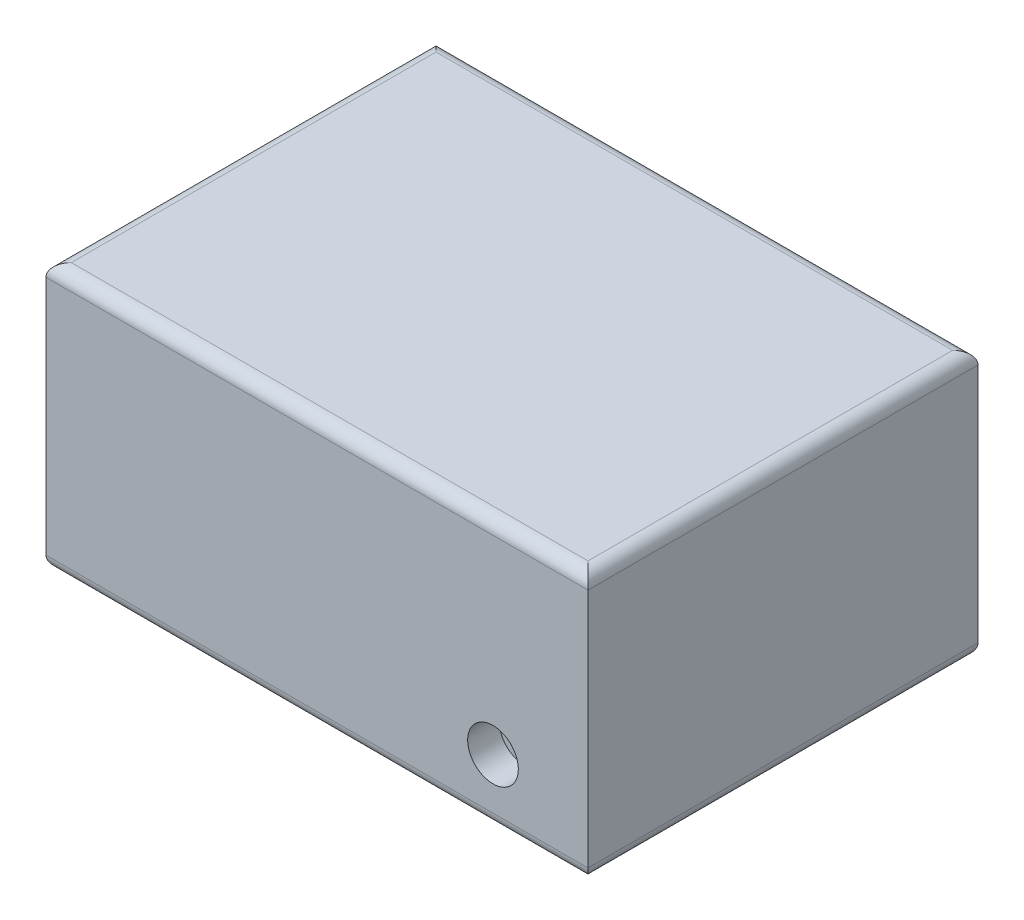
ISO-10303-21;
HEADER;
FILE_DESCRIPTION(('STEP AP214'),'2;1');
FILE_NAME('part.step','',(''),(''),'','','');
FILE_SCHEMA(('AUTOMOTIVE_DESIGN { 1 0 10303 214 1 1 1 1 }'));
ENDSEC;
DATA;
#1=APPLICATION_CONTEXT('core data for automotive mechanical design processes');
#2=APPLICATION_PROTOCOL_DEFINITION('international standard','automotive_design',2000,#1);
#3=PRODUCT_CONTEXT('',#1,'mechanical');
#4=PRODUCT('Part','Part','',(#3));
#5=PRODUCT_RELATED_PRODUCT_CATEGORY('part','',(#4));
#6=PRODUCT_DEFINITION_FORMATION('','',#4);
#7=PRODUCT_DEFINITION_CONTEXT('part definition',#1,'design');
#8=PRODUCT_DEFINITION('design','',#6,#7);
#9=PRODUCT_DEFINITION_SHAPE('','',#8);
#10=(LENGTH_UNIT() NAMED_UNIT(*) SI_UNIT(.MILLI.,.METRE.));
#11=(NAMED_UNIT(*) PLANE_ANGLE_UNIT() SI_UNIT($,.RADIAN.));
#12=(NAMED_UNIT(*) SI_UNIT($,.STERADIAN.) SOLID_ANGLE_UNIT());
#13=UNCERTAINTY_MEASURE_WITH_UNIT(LENGTH_MEASURE(1.E-05),#10,'distance_accuracy_value','');
#14=(GEOMETRIC_REPRESENTATION_CONTEXT(3) GLOBAL_UNCERTAINTY_ASSIGNED_CONTEXT((#13)) GLOBAL_UNIT_ASSIGNED_CONTEXT((#10,
#11,#12)) REPRESENTATION_CONTEXT('',''));
#15=CARTESIAN_POINT('',(0.,0.,0.));
#16=DIRECTION('',(0.,0.,1.));
#17=DIRECTION('',(1.,0.,0.));
#18=AXIS2_PLACEMENT_3D('',#15,#16,#17);
#19=CARTESIAN_POINT('',(42.8,42.,30.8));
#20=DIRECTION('',(-1.,0.,0.));
#21=DIRECTION('',(0.,0.,1.));
#22=AXIS2_PLACEMENT_3D('',#19,#20,#21);
#23=PLANE('',#22);
#24=DIRECTION('',(0.,-1.,0.));
#25=VECTOR('',#24,1.);
#26=CARTESIAN_POINT('',(42.8,42.,30.8));
#27=LINE('',#26,#25);
#28=CARTESIAN_POINT('',(42.8,40.,30.8));
#29=VERTEX_POINT('',#28);
#30=CARTESIAN_POINT('',(42.8,2.00000000000002,30.8));
#31=VERTEX_POINT('',#30);
#32=EDGE_CURVE('E208',#29,#31,#27,.T.);
#33=ORIENTED_EDGE('',*,*,#32,.T.);
#34=DIRECTION('',(0.,0.,-1.));
#35=VECTOR('',#34,1.);
#36=CARTESIAN_POINT('',(42.8,2.,-30.8));
#37=LINE('',#36,#35);
#38=CARTESIAN_POINT('',(42.8,2.00000000000002,-30.8));
#39=VERTEX_POINT('',#38);
#40=EDGE_CURVE('E176',#31,#39,#37,.T.);
#41=ORIENTED_EDGE('',*,*,#40,.T.);
#42=DIRECTION('',(0.,-1.,0.));
#43=VECTOR('',#42,1.);
#44=CARTESIAN_POINT('',(42.8,42.,-30.8));
#45=LINE('',#44,#43);
#46=CARTESIAN_POINT('',(42.8,40.,-30.8));
#47=VERTEX_POINT('',#46);
#48=EDGE_CURVE('E133',#47,#39,#45,.T.);
#49=ORIENTED_EDGE('',*,*,#48,.F.);
#50=DIRECTION('',(0.,0.,-1.));
#51=VECTOR('',#50,1.);
#52=CARTESIAN_POINT('',(42.8,40.,30.8));
#53=LINE('',#52,#51);
#54=EDGE_CURVE('E179',#47,#29,#53,.F.);
#55=ORIENTED_EDGE('',*,*,#54,.T.);
#56=EDGE_LOOP('',(#33,#41,#49,#55));
#57=FACE_BOUND('',#56,.T.);
#58=ADVANCED_FACE('F43',(#57),#23,.F.);
#59=CARTESIAN_POINT('',(-42.8,42.,-30.8));
#60=DIRECTION('',(0.,0.,1.));
#61=DIRECTION('',(1.,0.,0.));
#62=AXIS2_PLACEMENT_3D('',#59,#60,#61);
#63=PLANE('',#62);
#64=ORIENTED_EDGE('',*,*,#48,.T.);
#65=DIRECTION('',(-1.,0.,0.));
#66=VECTOR('',#65,1.);
#67=CARTESIAN_POINT('',(-42.8,2.,-30.8));
#68=LINE('',#67,#66);
#69=CARTESIAN_POINT('',(-42.8,2.00000000000002,-30.8));
#70=VERTEX_POINT('',#69);
#71=EDGE_CURVE('E131',#39,#70,#68,.T.);
#72=ORIENTED_EDGE('',*,*,#71,.T.);
#73=DIRECTION('',(0.,-1.,0.));
#74=VECTOR('',#73,1.);
#75=CARTESIAN_POINT('',(-42.8,42.,-30.8));
#76=LINE('',#75,#74);
#77=CARTESIAN_POINT('',(-42.8,40.,-30.8));
#78=VERTEX_POINT('',#77);
#79=EDGE_CURVE('E113',#78,#70,#76,.T.);
#80=ORIENTED_EDGE('',*,*,#79,.F.);
#81=DIRECTION('',(-1.,0.,0.));
#82=VECTOR('',#81,1.);
#83=CARTESIAN_POINT('',(-42.8,40.,-30.8));
#84=LINE('',#83,#82);
#85=EDGE_CURVE('E128',#78,#47,#84,.F.);
#86=ORIENTED_EDGE('',*,*,#85,.T.);
#87=EDGE_LOOP('',(#64,#72,#80,#86));
#88=FACE_BOUND('',#87,.T.);
#89=ADVANCED_FACE('F127',(#88),#63,.F.);
#90=CARTESIAN_POINT('',(-42.8,42.,30.8));
#91=DIRECTION('',(1.,0.,0.));
#92=DIRECTION('',(0.,0.,-1.));
#93=AXIS2_PLACEMENT_3D('',#90,#91,#92);
#94=PLANE('',#93);
#95=ORIENTED_EDGE('',*,*,#79,.T.);
#96=DIRECTION('',(0.,0.,1.));
#97=VECTOR('',#96,1.);
#98=CARTESIAN_POINT('',(-42.8,2.,30.8));
#99=LINE('',#98,#97);
#100=CARTESIAN_POINT('',(-42.8,2.00000000000002,30.8));
#101=VERTEX_POINT('',#100);
#102=EDGE_CURVE('E120',#70,#101,#99,.T.);
#103=ORIENTED_EDGE('',*,*,#102,.T.);
#104=DIRECTION('',(0.,-1.,0.));
#105=VECTOR('',#104,1.);
#106=CARTESIAN_POINT('',(-42.8,42.,30.8));
#107=LINE('',#106,#105);
#108=CARTESIAN_POINT('',(-42.8,40.,30.8));
#109=VERTEX_POINT('',#108);
#110=EDGE_CURVE('E115',#109,#101,#107,.T.);
#111=ORIENTED_EDGE('',*,*,#110,.F.);
#112=DIRECTION('',(0.,0.,1.));
#113=VECTOR('',#112,1.);
#114=CARTESIAN_POINT('',(-42.8,40.,30.8));
#115=LINE('',#114,#113);
#116=EDGE_CURVE('E110',#109,#78,#115,.F.);
#117=ORIENTED_EDGE('',*,*,#116,.T.);
#118=EDGE_LOOP('',(#95,#103,#111,#117));
#119=FACE_BOUND('',#118,.T.);
#120=ADVANCED_FACE('F112',(#119),#94,.F.);
#121=CARTESIAN_POINT('',(-42.8,42.,30.8));
#122=DIRECTION('',(0.,0.,-1.));
#123=DIRECTION('',(-1.,0.,0.));
#124=AXIS2_PLACEMENT_3D('',#121,#122,#123);
#125=PLANE('',#124);
#126=CARTESIAN_POINT('',(27.8,10.,30.8));
#127=DIRECTION('',(0.,0.,1.));
#128=DIRECTION('',(1.,0.,0.));
#129=AXIS2_PLACEMENT_3D('',#126,#127,#128);
#130=CIRCLE('',#129,4.00000000000001);
#131=CARTESIAN_POINT('',(31.8,10.,30.8));
#132=VERTEX_POINT('',#131);
#133=EDGE_CURVE('E162',#132,#132,#130,.T.);
#134=ORIENTED_EDGE('',*,*,#133,.F.);
#135=EDGE_LOOP('',(#134));
#136=FACE_BOUND('',#135,.T.);
#137=ORIENTED_EDGE('',*,*,#110,.T.);
#138=DIRECTION('',(1.,0.,0.));
#139=VECTOR('',#138,1.);
#140=CARTESIAN_POINT('',(42.8,2.,30.8));
#141=LINE('',#140,#139);
#142=EDGE_CURVE('E182',#101,#31,#141,.T.);
#143=ORIENTED_EDGE('',*,*,#142,.T.);
#144=ORIENTED_EDGE('',*,*,#32,.F.);
#145=DIRECTION('',(1.,0.,0.));
#146=VECTOR('',#145,1.);
#147=CARTESIAN_POINT('',(-42.8,40.,30.8));
#148=LINE('',#147,#146);
#149=EDGE_CURVE('E185',#29,#109,#148,.F.);
#150=ORIENTED_EDGE('',*,*,#149,.T.);
#151=EDGE_LOOP('',(#137,#143,#144,#150));
#152=FACE_BOUND('',#151,.T.);
#153=ADVANCED_FACE('F229',(#136,#152),#125,.F.);
#154=CARTESIAN_POINT('',(0.,42.,0.));
#155=DIRECTION('',(0.,-1.,0.));
#156=DIRECTION('',(0.,0.,-1.));
#157=AXIS2_PLACEMENT_3D('',#154,#155,#156);
#158=PLANE('',#157);
#159=DIRECTION('',(0.,0.,1.));
#160=VECTOR('',#159,1.);
#161=CARTESIAN_POINT('',(-40.8,42.,0.));
#162=LINE('',#161,#160);
#163=CARTESIAN_POINT('',(-40.8,42.,-28.8));
#164=VERTEX_POINT('',#163);
#165=CARTESIAN_POINT('',(-40.8,42.,28.8));
#166=VERTEX_POINT('',#165);
#167=EDGE_CURVE('E53',#164,#166,#162,.T.);
#168=ORIENTED_EDGE('',*,*,#167,.T.);
#169=DIRECTION('',(1.,0.,0.));
#170=VECTOR('',#169,1.);
#171=CARTESIAN_POINT('',(0.,42.,28.8));
#172=LINE('',#171,#170);
#173=CARTESIAN_POINT('',(40.8,42.,28.8));
#174=VERTEX_POINT('',#173);
#175=EDGE_CURVE('E11',#166,#174,#172,.T.);
#176=ORIENTED_EDGE('',*,*,#175,.T.);
#177=DIRECTION('',(0.,0.,-1.));
#178=VECTOR('',#177,1.);
#179=CARTESIAN_POINT('',(40.8,42.,0.));
#180=LINE('',#179,#178);
#181=CARTESIAN_POINT('',(40.8,42.,-28.8));
#182=VERTEX_POINT('',#181);
#183=EDGE_CURVE('E173',#174,#182,#180,.T.);
#184=ORIENTED_EDGE('',*,*,#183,.T.);
#185=DIRECTION('',(-1.,0.,0.));
#186=VECTOR('',#185,1.);
#187=CARTESIAN_POINT('',(0.,42.,-28.8));
#188=LINE('',#187,#186);
#189=EDGE_CURVE('E64',#182,#164,#188,.T.);
#190=ORIENTED_EDGE('',*,*,#189,.T.);
#191=EDGE_LOOP('',(#168,#176,#184,#190));
#192=FACE_BOUND('',#191,.T.);
#193=ADVANCED_FACE('F232',(#192),#158,.F.);
#194=CARTESIAN_POINT('',(0.,0.,0.));
#195=DIRECTION('',(0.,-1.,0.));
#196=DIRECTION('',(0.,0.,-1.));
#197=AXIS2_PLACEMENT_3D('',#194,#195,#196);
#198=PLANE('',#197);
#199=DIRECTION('',(0.,0.,1.));
#200=VECTOR('',#199,1.);
#201=CARTESIAN_POINT('',(-40.8,0.,-30.8));
#202=LINE('',#201,#200);
#203=CARTESIAN_POINT('',(-40.8,0.,28.8));
#204=VERTEX_POINT('',#203);
#205=CARTESIAN_POINT('',(-40.8,0.,-28.8));
#206=VERTEX_POINT('',#205);
#207=EDGE_CURVE('E193',#204,#206,#202,.F.);
#208=ORIENTED_EDGE('',*,*,#207,.T.);
#209=DIRECTION('',(-1.,0.,0.));
#210=VECTOR('',#209,1.);
#211=CARTESIAN_POINT('',(42.8,0.,-28.8));
#212=LINE('',#211,#210);
#213=CARTESIAN_POINT('',(40.8,0.,-28.8));
#214=VERTEX_POINT('',#213);
#215=EDGE_CURVE('E121',#206,#214,#212,.F.);
#216=ORIENTED_EDGE('',*,*,#215,.T.);
#217=DIRECTION('',(0.,0.,-1.));
#218=VECTOR('',#217,1.);
#219=CARTESIAN_POINT('',(40.8,0.,30.8));
#220=LINE('',#219,#218);
#221=CARTESIAN_POINT('',(40.8,0.,28.8));
#222=VERTEX_POINT('',#221);
#223=EDGE_CURVE('E199',#214,#222,#220,.F.);
#224=ORIENTED_EDGE('',*,*,#223,.T.);
#225=DIRECTION('',(1.,0.,0.));
#226=VECTOR('',#225,1.);
#227=CARTESIAN_POINT('',(-42.8,0.,28.8));
#228=LINE('',#227,#226);
#229=EDGE_CURVE('E196',#222,#204,#228,.F.);
#230=ORIENTED_EDGE('',*,*,#229,.T.);
#231=EDGE_LOOP('',(#208,#216,#224,#230));
#232=FACE_BOUND('',#231,.T.);
#233=ADVANCED_FACE('F225',(#232),#198,.T.);
#234=CARTESIAN_POINT('',(27.8,10.,25.8));
#235=DIRECTION('',(0.,0.,1.));
#236=DIRECTION('',(1.,0.,0.));
#237=AXIS2_PLACEMENT_3D('',#234,#235,#236);
#238=CYLINDRICAL_SURFACE('',#237,4.00000000000001);
#239=CARTESIAN_POINT('',(27.8,10.,25.8));
#240=DIRECTION('',(0.,0.,1.));
#241=DIRECTION('',(1.,0.,0.));
#242=AXIS2_PLACEMENT_3D('',#239,#240,#241);
#243=CIRCLE('',#242,4.00000000000001);
#244=CARTESIAN_POINT('',(31.8,10.,25.8));
#245=VERTEX_POINT('',#244);
#246=EDGE_CURVE('E212',#245,#245,#243,.T.);
#247=ORIENTED_EDGE('',*,*,#246,.F.);
#248=EDGE_LOOP('',(#247));
#249=FACE_BOUND('',#248,.T.);
#250=ORIENTED_EDGE('',*,*,#133,.T.);
#251=EDGE_LOOP('',(#250));
#252=FACE_BOUND('',#251,.T.);
#253=ADVANCED_FACE('F222',(#249,#252),#238,.F.);
#254=CARTESIAN_POINT('',(27.8,10.,25.8));
#255=DIRECTION('',(0.,0.,1.));
#256=DIRECTION('',(1.,0.,0.));
#257=AXIS2_PLACEMENT_3D('',#254,#255,#256);
#258=PLANE('',#257);
#259=ORIENTED_EDGE('',*,*,#246,.T.);
#260=EDGE_LOOP('',(#259));
#261=FACE_BOUND('',#260,.T.);
#262=ADVANCED_FACE('F220',(#261),#258,.T.);
#263=CARTESIAN_POINT('',(-42.8,2.,28.8));
#264=DIRECTION('',(-1.,0.,0.));
#265=DIRECTION('',(0.,0.,1.));
#266=AXIS2_PLACEMENT_3D('',#263,#264,#265);
#267=CYLINDRICAL_SURFACE('',#266,2.);
#268=CARTESIAN_POINT('',(-40.8,2.,28.8));
#269=DIRECTION('',(-0.707106781186547,0.,-0.707106781186547));
#270=DIRECTION('',(-0.707106781186547,0.,0.707106781186547));
#271=AXIS2_PLACEMENT_3D('',#268,#269,#270);
#272=ELLIPSE('',#271,2.82842712474619,2.);
#273=EDGE_CURVE('E163',#204,#101,#272,.T.);
#274=ORIENTED_EDGE('',*,*,#273,.F.);
#275=ORIENTED_EDGE('',*,*,#229,.F.);
#276=CARTESIAN_POINT('',(40.8,2.,28.8));
#277=DIRECTION('',(-0.707106781186547,0.,0.707106781186547));
#278=DIRECTION('',(0.707106781186547,0.,0.707106781186547));
#279=AXIS2_PLACEMENT_3D('',#276,#277,#278);
#280=ELLIPSE('',#279,2.82842712474619,2.);
#281=EDGE_CURVE('E158',#31,#222,#280,.F.);
#282=ORIENTED_EDGE('',*,*,#281,.F.);
#283=ORIENTED_EDGE('',*,*,#142,.F.);
#284=EDGE_LOOP('',(#274,#275,#282,#283));
#285=FACE_BOUND('',#284,.T.);
#286=ADVANCED_FACE('F240',(#285),#267,.T.);
#287=CARTESIAN_POINT('',(40.8,2.,30.8));
#288=DIRECTION('',(0.,0.,1.));
#289=DIRECTION('',(1.,0.,0.));
#290=AXIS2_PLACEMENT_3D('',#287,#288,#289);
#291=CYLINDRICAL_SURFACE('',#290,2.);
#292=ORIENTED_EDGE('',*,*,#281,.T.);
#293=ORIENTED_EDGE('',*,*,#223,.F.);
#294=CARTESIAN_POINT('',(40.8,2.,-28.8));
#295=DIRECTION('',(0.707106781186547,0.,0.707106781186547));
#296=DIRECTION('',(-0.707106781186547,0.,0.707106781186547));
#297=AXIS2_PLACEMENT_3D('',#294,#295,#296);
#298=ELLIPSE('',#297,2.82842712474619,2.);
#299=EDGE_CURVE('E147',#39,#214,#298,.F.);
#300=ORIENTED_EDGE('',*,*,#299,.F.);
#301=ORIENTED_EDGE('',*,*,#40,.F.);
#302=EDGE_LOOP('',(#292,#293,#300,#301));
#303=FACE_BOUND('',#302,.T.);
#304=ADVANCED_FACE('F255',(#303),#291,.T.);
#305=CARTESIAN_POINT('',(-40.8,2.,30.8));
#306=DIRECTION('',(0.,0.,-1.));
#307=DIRECTION('',(-1.,0.,0.));
#308=AXIS2_PLACEMENT_3D('',#305,#306,#307);
#309=CYLINDRICAL_SURFACE('',#308,2.);
#310=ORIENTED_EDGE('',*,*,#273,.T.);
#311=ORIENTED_EDGE('',*,*,#102,.F.);
#312=CARTESIAN_POINT('',(-40.8,2.,-28.8));
#313=DIRECTION('',(0.707106781186547,0.,-0.707106781186547));
#314=DIRECTION('',(-0.707106781186547,0.,-0.707106781186547));
#315=AXIS2_PLACEMENT_3D('',#312,#313,#314);
#316=ELLIPSE('',#315,2.82842712474619,2.);
#317=EDGE_CURVE('E144',#206,#70,#316,.T.);
#318=ORIENTED_EDGE('',*,*,#317,.F.);
#319=ORIENTED_EDGE('',*,*,#207,.F.);
#320=EDGE_LOOP('',(#310,#311,#318,#319));
#321=FACE_BOUND('',#320,.T.);
#322=ADVANCED_FACE('F246',(#321),#309,.T.);
#323=CARTESIAN_POINT('',(-42.8,2.,-28.8));
#324=DIRECTION('',(1.,0.,0.));
#325=DIRECTION('',(0.,0.,-1.));
#326=AXIS2_PLACEMENT_3D('',#323,#324,#325);
#327=CYLINDRICAL_SURFACE('',#326,2.);
#328=ORIENTED_EDGE('',*,*,#299,.T.);
#329=ORIENTED_EDGE('',*,*,#215,.F.);
#330=ORIENTED_EDGE('',*,*,#317,.T.);
#331=ORIENTED_EDGE('',*,*,#71,.F.);
#332=EDGE_LOOP('',(#328,#329,#330,#331));
#333=FACE_BOUND('',#332,.T.);
#334=ADVANCED_FACE('F251',(#333),#327,.T.);
#335=CARTESIAN_POINT('',(0.,40.,-28.8));
#336=DIRECTION('',(-1.,0.,0.));
#337=DIRECTION('',(0.,0.,1.));
#338=AXIS2_PLACEMENT_3D('',#335,#336,#337);
#339=CYLINDRICAL_SURFACE('',#338,2.);
#340=CARTESIAN_POINT('',(40.8,40.,-28.8));
#341=DIRECTION('',(-0.707106781186547,0.,-0.707106781186547));
#342=DIRECTION('',(0.707106781186547,0.,-0.707106781186547));
#343=AXIS2_PLACEMENT_3D('',#340,#341,#342);
#344=ELLIPSE('',#343,2.82842712474619,2.);
#345=EDGE_CURVE('E138',#47,#182,#344,.F.);
#346=ORIENTED_EDGE('',*,*,#345,.F.);
#347=ORIENTED_EDGE('',*,*,#85,.F.);
#348=CARTESIAN_POINT('',(-40.8,40.,-28.8));
#349=DIRECTION('',(-0.707106781186547,0.,0.707106781186547));
#350=DIRECTION('',(-0.707106781186547,0.,-0.707106781186547));
#351=AXIS2_PLACEMENT_3D('',#348,#349,#350);
#352=ELLIPSE('',#351,2.82842712474619,2.);
#353=EDGE_CURVE('E47',#164,#78,#352,.T.);
#354=ORIENTED_EDGE('',*,*,#353,.F.);
#355=ORIENTED_EDGE('',*,*,#189,.F.);
#356=EDGE_LOOP('',(#346,#347,#354,#355));
#357=FACE_BOUND('',#356,.T.);
#358=ADVANCED_FACE('F45',(#357),#339,.T.);
#359=CARTESIAN_POINT('',(-40.8,40.,0.));
#360=DIRECTION('',(0.,0.,1.));
#361=DIRECTION('',(1.,0.,0.));
#362=AXIS2_PLACEMENT_3D('',#359,#360,#361);
#363=CYLINDRICAL_SURFACE('',#362,2.);
#364=ORIENTED_EDGE('',*,*,#353,.T.);
#365=ORIENTED_EDGE('',*,*,#116,.F.);
#366=CARTESIAN_POINT('',(-40.8,40.,28.8));
#367=DIRECTION('',(0.707106781186547,0.,0.707106781186547));
#368=DIRECTION('',(-0.707106781186547,0.,0.707106781186547));
#369=AXIS2_PLACEMENT_3D('',#366,#367,#368);
#370=ELLIPSE('',#369,2.82842712474619,2.);
#371=EDGE_CURVE('E149',#166,#109,#370,.T.);
#372=ORIENTED_EDGE('',*,*,#371,.F.);
#373=ORIENTED_EDGE('',*,*,#167,.F.);
#374=EDGE_LOOP('',(#364,#365,#372,#373));
#375=FACE_BOUND('',#374,.T.);
#376=ADVANCED_FACE('F142',(#375),#363,.T.);
#377=CARTESIAN_POINT('',(40.8,40.,0.));
#378=DIRECTION('',(0.,0.,-1.));
#379=DIRECTION('',(-1.,0.,0.));
#380=AXIS2_PLACEMENT_3D('',#377,#378,#379);
#381=CYLINDRICAL_SURFACE('',#380,2.);
#382=ORIENTED_EDGE('',*,*,#345,.T.);
#383=ORIENTED_EDGE('',*,*,#183,.F.);
#384=CARTESIAN_POINT('',(40.8,40.,28.8));
#385=DIRECTION('',(0.707106781186547,0.,-0.707106781186547));
#386=DIRECTION('',(-0.707106781186547,0.,-0.707106781186547));
#387=AXIS2_PLACEMENT_3D('',#384,#385,#386);
#388=ELLIPSE('',#387,2.82842712474619,2.);
#389=EDGE_CURVE('E153',#29,#174,#388,.F.);
#390=ORIENTED_EDGE('',*,*,#389,.F.);
#391=ORIENTED_EDGE('',*,*,#54,.F.);
#392=EDGE_LOOP('',(#382,#383,#390,#391));
#393=FACE_BOUND('',#392,.T.);
#394=ADVANCED_FACE('F261',(#393),#381,.T.);
#395=CARTESIAN_POINT('',(0.,40.,28.8));
#396=DIRECTION('',(1.,0.,0.));
#397=DIRECTION('',(0.,0.,-1.));
#398=AXIS2_PLACEMENT_3D('',#395,#396,#397);
#399=CYLINDRICAL_SURFACE('',#398,2.);
#400=ORIENTED_EDGE('',*,*,#371,.T.);
#401=ORIENTED_EDGE('',*,*,#149,.F.);
#402=ORIENTED_EDGE('',*,*,#389,.T.);
#403=ORIENTED_EDGE('',*,*,#175,.F.);
#404=EDGE_LOOP('',(#400,#401,#402,#403));
#405=FACE_BOUND('',#404,.T.);
#406=ADVANCED_FACE('F259',(#405),#399,.T.);
#407=CLOSED_SHELL('',(#58,#89,#120,#153,#193,#233,#253,#262,#286,#304,#322,#334,#358,#376,#394,#406));
#408=MANIFOLD_SOLID_BREP('B2',#407);
#409=ADVANCED_BREP_SHAPE_REPRESENTATION('',(#18,#408),#14);
#410=SHAPE_DEFINITION_REPRESENTATION(#9,#409);
ENDSEC;
END-ISO-10303-21;
